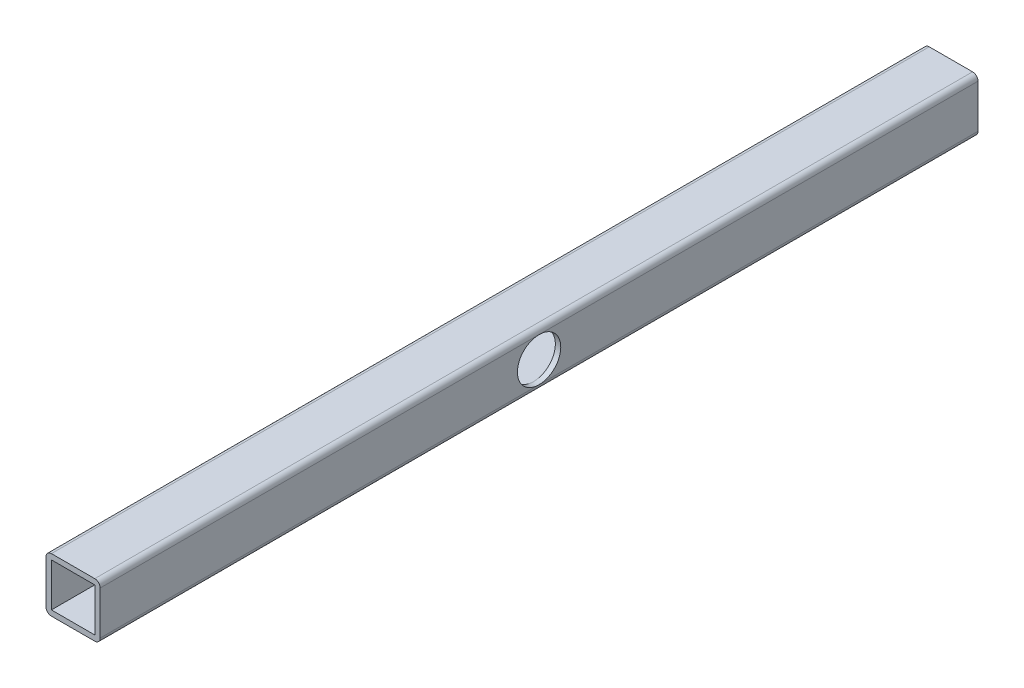
ISO-10303-21;
HEADER;
FILE_DESCRIPTION(('STEP AP214'),'2;1');
FILE_NAME('part.step','',(''),(''),'','','');
FILE_SCHEMA(('AUTOMOTIVE_DESIGN { 1 0 10303 214 1 1 1 1 }'));
ENDSEC;
DATA;
#1=APPLICATION_CONTEXT('core data for automotive mechanical design processes');
#2=APPLICATION_PROTOCOL_DEFINITION('international standard','automotive_design',2000,#1);
#3=PRODUCT_CONTEXT('',#1,'mechanical');
#4=PRODUCT('Part','Part','',(#3));
#5=PRODUCT_RELATED_PRODUCT_CATEGORY('part','',(#4));
#6=PRODUCT_DEFINITION_FORMATION('','',#4);
#7=PRODUCT_DEFINITION_CONTEXT('part definition',#1,'design');
#8=PRODUCT_DEFINITION('design','',#6,#7);
#9=PRODUCT_DEFINITION_SHAPE('','',#8);
#10=(LENGTH_UNIT() NAMED_UNIT(*) SI_UNIT(.MILLI.,.METRE.));
#11=(NAMED_UNIT(*) PLANE_ANGLE_UNIT() SI_UNIT($,.RADIAN.));
#12=(NAMED_UNIT(*) SI_UNIT($,.STERADIAN.) SOLID_ANGLE_UNIT());
#13=UNCERTAINTY_MEASURE_WITH_UNIT(LENGTH_MEASURE(1.E-05),#10,'distance_accuracy_value','');
#14=(GEOMETRIC_REPRESENTATION_CONTEXT(3) GLOBAL_UNCERTAINTY_ASSIGNED_CONTEXT((#13)) GLOBAL_UNIT_ASSIGNED_CONTEXT((#10,
#11,#12)) REPRESENTATION_CONTEXT('',''));
#15=CARTESIAN_POINT('',(0.,0.,0.));
#16=DIRECTION('',(0.,0.,1.));
#17=DIRECTION('',(1.,0.,0.));
#18=AXIS2_PLACEMENT_3D('',#15,#16,#17);
#19=CARTESIAN_POINT('',(50.,-50.,1625.));
#20=DIRECTION('',(-1.,0.,0.));
#21=DIRECTION('',(0.,0.,1.));
#22=AXIS2_PLACEMENT_3D('',#19,#20,#21);
#23=PLANE('',#22);
#24=DIRECTION('',(0.,0.,-1.));
#25=VECTOR('',#24,1.);
#26=CARTESIAN_POINT('',(50.,40.,1625.));
#27=LINE('',#26,#25);
#28=CARTESIAN_POINT('',(50.,40.,4.99999999999989));
#29=VERTEX_POINT('',#28);
#30=CARTESIAN_POINT('',(50.,40.,815.));
#31=VERTEX_POINT('',#30);
#32=EDGE_CURVE('E231',#29,#31,#27,.F.);
#33=ORIENTED_EDGE('',*,*,#32,.T.);
#34=CARTESIAN_POINT('',(50.,0.,815.));
#35=DIRECTION('',(1.,0.,0.));
#36=DIRECTION('',(0.,0.,-1.));
#37=AXIS2_PLACEMENT_3D('',#34,#35,#36);
#38=CIRCLE('',#37,40.);
#39=CARTESIAN_POINT('',(50.,-40.,815.));
#40=VERTEX_POINT('',#39);
#41=EDGE_CURVE('E294',#40,#31,#38,.T.);
#42=ORIENTED_EDGE('',*,*,#41,.F.);
#43=DIRECTION('',(0.,0.,-1.));
#44=VECTOR('',#43,1.);
#45=CARTESIAN_POINT('',(50.,-40.,1625.));
#46=LINE('',#45,#44);
#47=CARTESIAN_POINT('',(50.,-40.,4.99999999999989));
#48=VERTEX_POINT('',#47);
#49=EDGE_CURVE('E233',#40,#48,#46,.T.);
#50=ORIENTED_EDGE('',*,*,#49,.T.);
#51=DIRECTION('',(0.,1.,0.));
#52=VECTOR('',#51,1.);
#53=CARTESIAN_POINT('',(50.,-50.,5.));
#54=LINE('',#53,#52);
#55=EDGE_CURVE('E221',#48,#29,#54,.T.);
#56=ORIENTED_EDGE('',*,*,#55,.T.);
#57=EDGE_LOOP('',(#33,#42,#50,#56));
#58=FACE_BOUND('',#57,.T.);
#59=ADVANCED_FACE('F62',(#58),#23,.F.);
#60=CARTESIAN_POINT('',(-50.,-50.,1625.));
#61=DIRECTION('',(1.,0.,0.));
#62=DIRECTION('',(0.,0.,-1.));
#63=AXIS2_PLACEMENT_3D('',#60,#61,#62);
#64=PLANE('',#63);
#65=DIRECTION('',(0.,0.,-1.));
#66=VECTOR('',#65,1.);
#67=CARTESIAN_POINT('',(-50.,40.,1625.));
#68=LINE('',#67,#66);
#69=CARTESIAN_POINT('',(-50.,40.,1625.));
#70=VERTEX_POINT('',#69);
#71=CARTESIAN_POINT('',(-50.,40.,815.));
#72=VERTEX_POINT('',#71);
#73=EDGE_CURVE('E190',#70,#72,#68,.T.);
#74=ORIENTED_EDGE('',*,*,#73,.T.);
#75=CARTESIAN_POINT('',(-50.,0.,815.));
#76=DIRECTION('',(1.,0.,0.));
#77=DIRECTION('',(0.,0.,-1.));
#78=AXIS2_PLACEMENT_3D('',#75,#76,#77);
#79=CIRCLE('',#78,40.);
#80=CARTESIAN_POINT('',(-50.,-40.,815.));
#81=VERTEX_POINT('',#80);
#82=EDGE_CURVE('E176',#72,#81,#79,.T.);
#83=ORIENTED_EDGE('',*,*,#82,.T.);
#84=DIRECTION('',(0.,0.,-1.));
#85=VECTOR('',#84,1.);
#86=CARTESIAN_POINT('',(-50.,-40.,1625.));
#87=LINE('',#86,#85);
#88=CARTESIAN_POINT('',(-50.,-40.,1625.));
#89=VERTEX_POINT('',#88);
#90=EDGE_CURVE('E187',#81,#89,#87,.F.);
#91=ORIENTED_EDGE('',*,*,#90,.T.);
#92=DIRECTION('',(0.,-1.,0.));
#93=VECTOR('',#92,1.);
#94=CARTESIAN_POINT('',(-50.,-50.,1625.));
#95=LINE('',#94,#93);
#96=EDGE_CURVE('E276',#70,#89,#95,.T.);
#97=ORIENTED_EDGE('',*,*,#96,.F.);
#98=EDGE_LOOP('',(#74,#83,#91,#97));
#99=FACE_BOUND('',#98,.T.);
#100=ADVANCED_FACE('F185',(#99),#64,.F.);
#101=CARTESIAN_POINT('',(40.,0.,1625.));
#102=DIRECTION('',(-1.,0.,0.));
#103=DIRECTION('',(0.,0.,1.));
#104=AXIS2_PLACEMENT_3D('',#101,#102,#103);
#105=PLANE('',#104);
#106=CARTESIAN_POINT('',(40.,0.,815.));
#107=DIRECTION('',(-1.,0.,0.));
#108=DIRECTION('',(0.,0.,1.));
#109=AXIS2_PLACEMENT_3D('',#106,#107,#108);
#110=CIRCLE('',#109,40.);
#111=CARTESIAN_POINT('',(40.,40.,815.));
#112=VERTEX_POINT('',#111);
#113=CARTESIAN_POINT('',(40.,-40.,815.));
#114=VERTEX_POINT('',#113);
#115=EDGE_CURVE('E76',#112,#114,#110,.T.);
#116=ORIENTED_EDGE('',*,*,#115,.F.);
#117=DIRECTION('',(0.,0.,-1.));
#118=VECTOR('',#117,1.);
#119=CARTESIAN_POINT('',(40.,40.,1625.));
#120=LINE('',#119,#118);
#121=CARTESIAN_POINT('',(40.,40.,5.));
#122=VERTEX_POINT('',#121);
#123=EDGE_CURVE('E332',#112,#122,#120,.T.);
#124=ORIENTED_EDGE('',*,*,#123,.T.);
#125=DIRECTION('',(0.,1.,0.));
#126=VECTOR('',#125,1.);
#127=CARTESIAN_POINT('',(40.,0.,5.));
#128=LINE('',#127,#126);
#129=CARTESIAN_POINT('',(40.,-40.,5.));
#130=VERTEX_POINT('',#129);
#131=EDGE_CURVE('E311',#130,#122,#128,.T.);
#132=ORIENTED_EDGE('',*,*,#131,.F.);
#133=DIRECTION('',(0.,0.,-1.));
#134=VECTOR('',#133,1.);
#135=CARTESIAN_POINT('',(40.,-40.,1625.));
#136=LINE('',#135,#134);
#137=EDGE_CURVE('E310',#114,#130,#136,.T.);
#138=ORIENTED_EDGE('',*,*,#137,.F.);
#139=EDGE_LOOP('',(#116,#124,#132,#138));
#140=FACE_BOUND('',#139,.T.);
#141=ADVANCED_FACE('F339',(#140),#105,.T.);
#142=CARTESIAN_POINT('',(-40.,0.,1625.));
#143=DIRECTION('',(1.,0.,0.));
#144=DIRECTION('',(0.,0.,-1.));
#145=AXIS2_PLACEMENT_3D('',#142,#143,#144);
#146=PLANE('',#145);
#147=CARTESIAN_POINT('',(-40.,0.,815.));
#148=DIRECTION('',(1.,0.,0.));
#149=DIRECTION('',(0.,0.,-1.));
#150=AXIS2_PLACEMENT_3D('',#147,#148,#149);
#151=CIRCLE('',#150,40.);
#152=CARTESIAN_POINT('',(-40.,40.,815.));
#153=VERTEX_POINT('',#152);
#154=CARTESIAN_POINT('',(-40.,-40.,815.));
#155=VERTEX_POINT('',#154);
#156=EDGE_CURVE('E83',#153,#155,#151,.T.);
#157=ORIENTED_EDGE('',*,*,#156,.F.);
#158=DIRECTION('',(0.,0.,-1.));
#159=VECTOR('',#158,1.);
#160=CARTESIAN_POINT('',(-40.,40.,1625.));
#161=LINE('',#160,#159);
#162=CARTESIAN_POINT('',(-40.,40.,1625.));
#163=VERTEX_POINT('',#162);
#164=EDGE_CURVE('E330',#163,#153,#161,.T.);
#165=ORIENTED_EDGE('',*,*,#164,.F.);
#166=DIRECTION('',(0.,-1.,0.));
#167=VECTOR('',#166,1.);
#168=CARTESIAN_POINT('',(-40.,0.,1625.));
#169=LINE('',#168,#167);
#170=CARTESIAN_POINT('',(-40.,-40.,1625.));
#171=VERTEX_POINT('',#170);
#172=EDGE_CURVE('E305',#163,#171,#169,.T.);
#173=ORIENTED_EDGE('',*,*,#172,.T.);
#174=DIRECTION('',(0.,0.,-1.));
#175=VECTOR('',#174,1.);
#176=CARTESIAN_POINT('',(-40.,-40.,1625.));
#177=LINE('',#176,#175);
#178=EDGE_CURVE('E326',#171,#155,#177,.T.);
#179=ORIENTED_EDGE('',*,*,#178,.T.);
#180=EDGE_LOOP('',(#157,#165,#173,#179));
#181=FACE_BOUND('',#180,.T.);
#182=ADVANCED_FACE('F361',(#181),#146,.T.);
#183=CARTESIAN_POINT('',(0.,0.,1625.));
#184=DIRECTION('',(0.,0.,1.));
#185=DIRECTION('',(1.,0.,0.));
#186=AXIS2_PLACEMENT_3D('',#183,#184,#185);
#187=PLANE('',#186);
#188=DIRECTION('',(1.,0.,0.));
#189=VECTOR('',#188,1.);
#190=CARTESIAN_POINT('',(-50.,-50.,1625.));
#191=LINE('',#190,#189);
#192=CARTESIAN_POINT('',(-40.,-50.,1625.));
#193=VERTEX_POINT('',#192);
#194=CARTESIAN_POINT('',(40.,-50.,1625.));
#195=VERTEX_POINT('',#194);
#196=EDGE_CURVE('E243',#193,#195,#191,.T.);
#197=ORIENTED_EDGE('',*,*,#196,.T.);
#198=CARTESIAN_POINT('',(40.,-40.,1625.));
#199=DIRECTION('',(0.,0.,1.));
#200=DIRECTION('',(1.,0.,0.));
#201=AXIS2_PLACEMENT_3D('',#198,#199,#200);
#202=CIRCLE('',#201,10.);
#203=CARTESIAN_POINT('',(50.,-40.,1625.));
#204=VERTEX_POINT('',#203);
#205=EDGE_CURVE('E258',#195,#204,#202,.T.);
#206=ORIENTED_EDGE('',*,*,#205,.T.);
#207=DIRECTION('',(0.,1.,0.));
#208=VECTOR('',#207,1.);
#209=CARTESIAN_POINT('',(50.,-50.,1625.));
#210=LINE('',#209,#208);
#211=CARTESIAN_POINT('',(50.,40.,1625.));
#212=VERTEX_POINT('',#211);
#213=EDGE_CURVE('E277',#204,#212,#210,.T.);
#214=ORIENTED_EDGE('',*,*,#213,.T.);
#215=CARTESIAN_POINT('',(40.,40.,1625.));
#216=DIRECTION('',(0.,0.,1.));
#217=DIRECTION('',(1.,0.,0.));
#218=AXIS2_PLACEMENT_3D('',#215,#216,#217);
#219=CIRCLE('',#218,10.);
#220=CARTESIAN_POINT('',(40.,50.,1625.));
#221=VERTEX_POINT('',#220);
#222=EDGE_CURVE('E256',#212,#221,#219,.T.);
#223=ORIENTED_EDGE('',*,*,#222,.T.);
#224=DIRECTION('',(-1.,0.,0.));
#225=VECTOR('',#224,1.);
#226=CARTESIAN_POINT('',(-50.,50.,1625.));
#227=LINE('',#226,#225);
#228=CARTESIAN_POINT('',(-40.,50.,1625.));
#229=VERTEX_POINT('',#228);
#230=EDGE_CURVE('E273',#221,#229,#227,.T.);
#231=ORIENTED_EDGE('',*,*,#230,.T.);
#232=CARTESIAN_POINT('',(-40.,40.,1625.));
#233=DIRECTION('',(0.,0.,1.));
#234=DIRECTION('',(1.,0.,0.));
#235=AXIS2_PLACEMENT_3D('',#232,#233,#234);
#236=CIRCLE('',#235,10.);
#237=EDGE_CURVE('E254',#229,#70,#236,.T.);
#238=ORIENTED_EDGE('',*,*,#237,.T.);
#239=ORIENTED_EDGE('',*,*,#96,.T.);
#240=CARTESIAN_POINT('',(-40.,-40.,1625.));
#241=DIRECTION('',(0.,0.,1.));
#242=DIRECTION('',(1.,0.,0.));
#243=AXIS2_PLACEMENT_3D('',#240,#241,#242);
#244=CIRCLE('',#243,10.);
#245=EDGE_CURVE('E199',#89,#193,#244,.T.);
#246=ORIENTED_EDGE('',*,*,#245,.T.);
#247=EDGE_LOOP('',(#197,#206,#214,#223,#231,#238,#239,#246));
#248=FACE_BOUND('',#247,.T.);
#249=DIRECTION('',(-1.,0.,0.));
#250=VECTOR('',#249,1.);
#251=CARTESIAN_POINT('',(0.,40.,1625.));
#252=LINE('',#251,#250);
#253=CARTESIAN_POINT('',(40.,40.,1625.));
#254=VERTEX_POINT('',#253);
#255=EDGE_CURVE('E302',#254,#163,#252,.T.);
#256=ORIENTED_EDGE('',*,*,#255,.F.);
#257=DIRECTION('',(0.,1.,0.));
#258=VECTOR('',#257,1.);
#259=CARTESIAN_POINT('',(40.,0.,1625.));
#260=LINE('',#259,#258);
#261=CARTESIAN_POINT('',(40.,-40.,1625.));
#262=VERTEX_POINT('',#261);
#263=EDGE_CURVE('E300',#262,#254,#260,.T.);
#264=ORIENTED_EDGE('',*,*,#263,.F.);
#265=DIRECTION('',(1.,0.,0.));
#266=VECTOR('',#265,1.);
#267=CARTESIAN_POINT('',(0.,-40.,1625.));
#268=LINE('',#267,#266);
#269=EDGE_CURVE('E308',#171,#262,#268,.T.);
#270=ORIENTED_EDGE('',*,*,#269,.F.);
#271=ORIENTED_EDGE('',*,*,#172,.F.);
#272=EDGE_LOOP('',(#256,#264,#270,#271));
#273=FACE_BOUND('',#272,.T.);
#274=ADVANCED_FACE('F274',(#248,#273),#187,.T.);
#275=EDGE_CURVE('E241',#204,#40,#46,.T.);
#276=ORIENTED_EDGE('',*,*,#275,.T.);
#277=EDGE_CURVE('E180',#31,#40,#38,.T.);
#278=ORIENTED_EDGE('',*,*,#277,.F.);
#279=EDGE_CURVE('E239',#31,#212,#27,.F.);
#280=ORIENTED_EDGE('',*,*,#279,.T.);
#281=ORIENTED_EDGE('',*,*,#213,.F.);
#282=EDGE_LOOP('',(#276,#278,#280,#281));
#283=FACE_BOUND('',#282,.T.);
#284=ADVANCED_FACE('F292',(#283),#23,.F.);
#285=CARTESIAN_POINT('',(-50.,50.,1625.));
#286=DIRECTION('',(0.,-1.,0.));
#287=DIRECTION('',(0.,0.,-1.));
#288=AXIS2_PLACEMENT_3D('',#285,#286,#287);
#289=PLANE('',#288);
#290=ORIENTED_EDGE('',*,*,#230,.F.);
#291=DIRECTION('',(0.,0.,-1.));
#292=VECTOR('',#291,1.);
#293=CARTESIAN_POINT('',(40.,50.,1625.));
#294=LINE('',#293,#292);
#295=CARTESIAN_POINT('',(40.,50.,4.99999999999989));
#296=VERTEX_POINT('',#295);
#297=EDGE_CURVE('E206',#221,#296,#294,.T.);
#298=ORIENTED_EDGE('',*,*,#297,.T.);
#299=DIRECTION('',(-1.,0.,0.));
#300=VECTOR('',#299,1.);
#301=CARTESIAN_POINT('',(-50.,50.,5.));
#302=LINE('',#301,#300);
#303=CARTESIAN_POINT('',(-40.,50.,4.99999999999989));
#304=VERTEX_POINT('',#303);
#305=EDGE_CURVE('E224',#296,#304,#302,.T.);
#306=ORIENTED_EDGE('',*,*,#305,.T.);
#307=DIRECTION('',(0.,0.,-1.));
#308=VECTOR('',#307,1.);
#309=CARTESIAN_POINT('',(-40.,50.,1625.));
#310=LINE('',#309,#308);
#311=EDGE_CURVE('E205',#304,#229,#310,.F.);
#312=ORIENTED_EDGE('',*,*,#311,.T.);
#313=EDGE_LOOP('',(#290,#298,#306,#312));
#314=FACE_BOUND('',#313,.T.);
#315=ADVANCED_FACE('F272',(#314),#289,.F.);
#316=CARTESIAN_POINT('',(-50.,-40.,4.99999999999989));
#317=VERTEX_POINT('',#316);
#318=EDGE_CURVE('E197',#317,#81,#87,.F.);
#319=ORIENTED_EDGE('',*,*,#318,.T.);
#320=EDGE_CURVE('E173',#81,#72,#79,.T.);
#321=ORIENTED_EDGE('',*,*,#320,.T.);
#322=CARTESIAN_POINT('',(-50.,40.,5.));
#323=VERTEX_POINT('',#322);
#324=EDGE_CURVE('E259',#72,#323,#68,.T.);
#325=ORIENTED_EDGE('',*,*,#324,.T.);
#326=DIRECTION('',(0.,-1.,0.));
#327=VECTOR('',#326,1.);
#328=CARTESIAN_POINT('',(-50.,-50.,5.));
#329=LINE('',#328,#327);
#330=EDGE_CURVE('E204',#323,#317,#329,.T.);
#331=ORIENTED_EDGE('',*,*,#330,.T.);
#332=EDGE_LOOP('',(#319,#321,#325,#331));
#333=FACE_BOUND('',#332,.T.);
#334=ADVANCED_FACE('F202',(#333),#64,.F.);
#335=CARTESIAN_POINT('',(-50.,-50.,1625.));
#336=DIRECTION('',(0.,1.,0.));
#337=DIRECTION('',(0.,0.,1.));
#338=AXIS2_PLACEMENT_3D('',#335,#336,#337);
#339=PLANE('',#338);
#340=DIRECTION('',(1.,0.,0.));
#341=VECTOR('',#340,1.);
#342=CARTESIAN_POINT('',(-50.,-50.,5.));
#343=LINE('',#342,#341);
#344=CARTESIAN_POINT('',(-40.,-50.,4.99999999999989));
#345=VERTEX_POINT('',#344);
#346=CARTESIAN_POINT('',(40.,-50.,4.99999999999989));
#347=VERTEX_POINT('',#346);
#348=EDGE_CURVE('E245',#345,#347,#343,.T.);
#349=ORIENTED_EDGE('',*,*,#348,.T.);
#350=DIRECTION('',(0.,0.,-1.));
#351=VECTOR('',#350,1.);
#352=CARTESIAN_POINT('',(40.,-50.,1625.));
#353=LINE('',#352,#351);
#354=EDGE_CURVE('E252',#347,#195,#353,.F.);
#355=ORIENTED_EDGE('',*,*,#354,.T.);
#356=ORIENTED_EDGE('',*,*,#196,.F.);
#357=DIRECTION('',(0.,0.,-1.));
#358=VECTOR('',#357,1.);
#359=CARTESIAN_POINT('',(-40.,-50.,1625.));
#360=LINE('',#359,#358);
#361=EDGE_CURVE('E249',#193,#345,#360,.T.);
#362=ORIENTED_EDGE('',*,*,#361,.T.);
#363=EDGE_LOOP('',(#349,#355,#356,#362));
#364=FACE_BOUND('',#363,.T.);
#365=ADVANCED_FACE('F388',(#364),#339,.F.);
#366=EDGE_CURVE('E298',#114,#112,#110,.T.);
#367=ORIENTED_EDGE('',*,*,#366,.F.);
#368=EDGE_CURVE('E322',#262,#114,#136,.T.);
#369=ORIENTED_EDGE('',*,*,#368,.F.);
#370=ORIENTED_EDGE('',*,*,#263,.T.);
#371=EDGE_CURVE('E234',#254,#112,#120,.T.);
#372=ORIENTED_EDGE('',*,*,#371,.T.);
#373=EDGE_LOOP('',(#367,#369,#370,#372));
#374=FACE_BOUND('',#373,.T.);
#375=ADVANCED_FACE('F357',(#374),#105,.T.);
#376=CARTESIAN_POINT('',(0.,40.,1625.));
#377=DIRECTION('',(0.,-1.,0.));
#378=DIRECTION('',(0.,0.,-1.));
#379=AXIS2_PLACEMENT_3D('',#376,#377,#378);
#380=PLANE('',#379);
#381=ORIENTED_EDGE('',*,*,#123,.F.);
#382=ORIENTED_EDGE('',*,*,#371,.F.);
#383=ORIENTED_EDGE('',*,*,#255,.T.);
#384=ORIENTED_EDGE('',*,*,#164,.T.);
#385=CARTESIAN_POINT('',(-40.,40.,5.));
#386=VERTEX_POINT('',#385);
#387=EDGE_CURVE('E329',#153,#386,#161,.T.);
#388=ORIENTED_EDGE('',*,*,#387,.T.);
#389=DIRECTION('',(-1.,0.,0.));
#390=VECTOR('',#389,1.);
#391=CARTESIAN_POINT('',(0.,40.,5.));
#392=LINE('',#391,#390);
#393=EDGE_CURVE('E314',#122,#386,#392,.T.);
#394=ORIENTED_EDGE('',*,*,#393,.F.);
#395=EDGE_LOOP('',(#381,#382,#383,#384,#388,#394));
#396=FACE_BOUND('',#395,.T.);
#397=ADVANCED_FACE('F346',(#396),#380,.T.);
#398=EDGE_CURVE('E191',#155,#153,#151,.T.);
#399=ORIENTED_EDGE('',*,*,#398,.F.);
#400=CARTESIAN_POINT('',(-40.,-40.,5.));
#401=VERTEX_POINT('',#400);
#402=EDGE_CURVE('E325',#155,#401,#177,.T.);
#403=ORIENTED_EDGE('',*,*,#402,.T.);
#404=DIRECTION('',(0.,-1.,0.));
#405=VECTOR('',#404,1.);
#406=CARTESIAN_POINT('',(-40.,0.,5.));
#407=LINE('',#406,#405);
#408=EDGE_CURVE('E317',#386,#401,#407,.T.);
#409=ORIENTED_EDGE('',*,*,#408,.F.);
#410=ORIENTED_EDGE('',*,*,#387,.F.);
#411=EDGE_LOOP('',(#399,#403,#409,#410));
#412=FACE_BOUND('',#411,.T.);
#413=ADVANCED_FACE('F350',(#412),#146,.T.);
#414=CARTESIAN_POINT('',(0.,-40.,1625.));
#415=DIRECTION('',(0.,1.,0.));
#416=DIRECTION('',(0.,0.,1.));
#417=AXIS2_PLACEMENT_3D('',#414,#415,#416);
#418=PLANE('',#417);
#419=ORIENTED_EDGE('',*,*,#368,.T.);
#420=ORIENTED_EDGE('',*,*,#137,.T.);
#421=DIRECTION('',(1.,0.,0.));
#422=VECTOR('',#421,1.);
#423=CARTESIAN_POINT('',(0.,-40.,5.));
#424=LINE('',#423,#422);
#425=EDGE_CURVE('E303',#401,#130,#424,.T.);
#426=ORIENTED_EDGE('',*,*,#425,.F.);
#427=ORIENTED_EDGE('',*,*,#402,.F.);
#428=ORIENTED_EDGE('',*,*,#178,.F.);
#429=ORIENTED_EDGE('',*,*,#269,.T.);
#430=EDGE_LOOP('',(#419,#420,#426,#427,#428,#429));
#431=FACE_BOUND('',#430,.T.);
#432=ADVANCED_FACE('F353',(#431),#418,.T.);
#433=CARTESIAN_POINT('',(40.,-40.,1625.));
#434=DIRECTION('',(0.,0.,-1.));
#435=DIRECTION('',(-1.,0.,0.));
#436=AXIS2_PLACEMENT_3D('',#433,#434,#435);
#437=CYLINDRICAL_SURFACE('',#436,10.);
#438=ORIENTED_EDGE('',*,*,#205,.F.);
#439=ORIENTED_EDGE('',*,*,#354,.F.);
#440=CARTESIAN_POINT('',(40.,-40.,4.99999999999989));
#441=DIRECTION('',(0.,0.,-1.));
#442=DIRECTION('',(-1.,0.,0.));
#443=AXIS2_PLACEMENT_3D('',#440,#441,#442);
#444=CIRCLE('',#443,10.);
#445=EDGE_CURVE('E213',#48,#347,#444,.T.);
#446=ORIENTED_EDGE('',*,*,#445,.F.);
#447=ORIENTED_EDGE('',*,*,#49,.F.);
#448=ORIENTED_EDGE('',*,*,#275,.F.);
#449=EDGE_LOOP('',(#438,#439,#446,#447,#448));
#450=FACE_BOUND('',#449,.T.);
#451=ADVANCED_FACE('F289',(#450),#437,.T.);
#452=CARTESIAN_POINT('',(-40.,-40.,1625.));
#453=DIRECTION('',(0.,0.,-1.));
#454=DIRECTION('',(-1.,0.,0.));
#455=AXIS2_PLACEMENT_3D('',#452,#453,#454);
#456=CYLINDRICAL_SURFACE('',#455,10.);
#457=ORIENTED_EDGE('',*,*,#245,.F.);
#458=ORIENTED_EDGE('',*,*,#90,.F.);
#459=ORIENTED_EDGE('',*,*,#318,.F.);
#460=CARTESIAN_POINT('',(-40.,-40.,4.99999999999989));
#461=DIRECTION('',(0.,0.,-1.));
#462=DIRECTION('',(-1.,0.,0.));
#463=AXIS2_PLACEMENT_3D('',#460,#461,#462);
#464=CIRCLE('',#463,10.);
#465=EDGE_CURVE('E215',#345,#317,#464,.T.);
#466=ORIENTED_EDGE('',*,*,#465,.F.);
#467=ORIENTED_EDGE('',*,*,#361,.F.);
#468=EDGE_LOOP('',(#457,#458,#459,#466,#467));
#469=FACE_BOUND('',#468,.T.);
#470=ADVANCED_FACE('F195',(#469),#456,.T.);
#471=CARTESIAN_POINT('',(40.,40.,1625.));
#472=DIRECTION('',(0.,0.,-1.));
#473=DIRECTION('',(-1.,0.,0.));
#474=AXIS2_PLACEMENT_3D('',#471,#472,#473);
#475=CYLINDRICAL_SURFACE('',#474,10.);
#476=ORIENTED_EDGE('',*,*,#222,.F.);
#477=ORIENTED_EDGE('',*,*,#279,.F.);
#478=ORIENTED_EDGE('',*,*,#32,.F.);
#479=CARTESIAN_POINT('',(40.,40.,4.99999999999989));
#480=DIRECTION('',(0.,0.,-1.));
#481=DIRECTION('',(-1.,0.,0.));
#482=AXIS2_PLACEMENT_3D('',#479,#480,#481);
#483=CIRCLE('',#482,10.);
#484=EDGE_CURVE('E70',#296,#29,#483,.T.);
#485=ORIENTED_EDGE('',*,*,#484,.F.);
#486=ORIENTED_EDGE('',*,*,#297,.F.);
#487=EDGE_LOOP('',(#476,#477,#478,#485,#486));
#488=FACE_BOUND('',#487,.T.);
#489=ADVANCED_FACE('F238',(#488),#475,.T.);
#490=CARTESIAN_POINT('',(-40.,40.,1625.));
#491=DIRECTION('',(0.,0.,-1.));
#492=DIRECTION('',(-1.,0.,0.));
#493=AXIS2_PLACEMENT_3D('',#490,#491,#492);
#494=CYLINDRICAL_SURFACE('',#493,10.);
#495=ORIENTED_EDGE('',*,*,#237,.F.);
#496=ORIENTED_EDGE('',*,*,#311,.F.);
#497=CARTESIAN_POINT('',(-40.,40.,4.99999999999989));
#498=DIRECTION('',(0.,0.,-1.));
#499=DIRECTION('',(-1.,0.,0.));
#500=AXIS2_PLACEMENT_3D('',#497,#498,#499);
#501=CIRCLE('',#500,10.);
#502=EDGE_CURVE('E12',#323,#304,#501,.T.);
#503=ORIENTED_EDGE('',*,*,#502,.F.);
#504=ORIENTED_EDGE('',*,*,#324,.F.);
#505=ORIENTED_EDGE('',*,*,#73,.F.);
#506=EDGE_LOOP('',(#495,#496,#503,#504,#505));
#507=FACE_BOUND('',#506,.T.);
#508=ADVANCED_FACE('F64',(#507),#494,.T.);
#509=CARTESIAN_POINT('',(-60.,74.000021915154,5.));
#510=DIRECTION('',(0.,0.,1.));
#511=DIRECTION('',(1.,0.,0.));
#512=AXIS2_PLACEMENT_3D('',#509,#510,#511);
#513=PLANE('',#512);
#514=ORIENTED_EDGE('',*,*,#425,.T.);
#515=ORIENTED_EDGE('',*,*,#131,.T.);
#516=ORIENTED_EDGE('',*,*,#393,.T.);
#517=ORIENTED_EDGE('',*,*,#408,.T.);
#518=EDGE_LOOP('',(#514,#515,#516,#517));
#519=FACE_BOUND('',#518,.T.);
#520=ORIENTED_EDGE('',*,*,#445,.T.);
#521=ORIENTED_EDGE('',*,*,#348,.F.);
#522=ORIENTED_EDGE('',*,*,#465,.T.);
#523=ORIENTED_EDGE('',*,*,#330,.F.);
#524=ORIENTED_EDGE('',*,*,#502,.T.);
#525=ORIENTED_EDGE('',*,*,#305,.F.);
#526=ORIENTED_EDGE('',*,*,#484,.T.);
#527=ORIENTED_EDGE('',*,*,#55,.F.);
#528=EDGE_LOOP('',(#520,#521,#522,#523,#524,#525,#526,#527));
#529=FACE_BOUND('',#528,.T.);
#530=ADVANCED_FACE('F220',(#519,#529),#513,.F.);
#531=CARTESIAN_POINT('',(-50.,0.,815.));
#532=DIRECTION('',(1.,0.,0.));
#533=DIRECTION('',(0.,0.,-1.));
#534=AXIS2_PLACEMENT_3D('',#531,#532,#533);
#535=CYLINDRICAL_SURFACE('',#534,40.);
#536=ORIENTED_EDGE('',*,*,#156,.T.);
#537=ORIENTED_EDGE('',*,*,#398,.T.);
#538=EDGE_LOOP('',(#536,#537));
#539=FACE_BOUND('',#538,.T.);
#540=ORIENTED_EDGE('',*,*,#82,.F.);
#541=ORIENTED_EDGE('',*,*,#320,.F.);
#542=EDGE_LOOP('',(#540,#541));
#543=FACE_BOUND('',#542,.T.);
#544=ADVANCED_FACE('F175',(#539,#543),#535,.F.);
#545=ORIENTED_EDGE('',*,*,#115,.T.);
#546=ORIENTED_EDGE('',*,*,#366,.T.);
#547=EDGE_LOOP('',(#545,#546));
#548=FACE_BOUND('',#547,.T.);
#549=ORIENTED_EDGE('',*,*,#277,.T.);
#550=ORIENTED_EDGE('',*,*,#41,.T.);
#551=EDGE_LOOP('',(#549,#550));
#552=FACE_BOUND('',#551,.T.);
#553=ADVANCED_FACE('F440',(#548,#552),#535,.F.);
#554=CLOSED_SHELL('',(#59,#100,#141,#182,#274,#284,#315,#334,#365,#375,#397,#413,#432,#451,#470,
#489,#508,#530,#544,#553));
#555=MANIFOLD_SOLID_BREP('B2',#554);
#556=ADVANCED_BREP_SHAPE_REPRESENTATION('',(#18,#555),#14);
#557=SHAPE_DEFINITION_REPRESENTATION(#9,#556);
ENDSEC;
END-ISO-10303-21;
